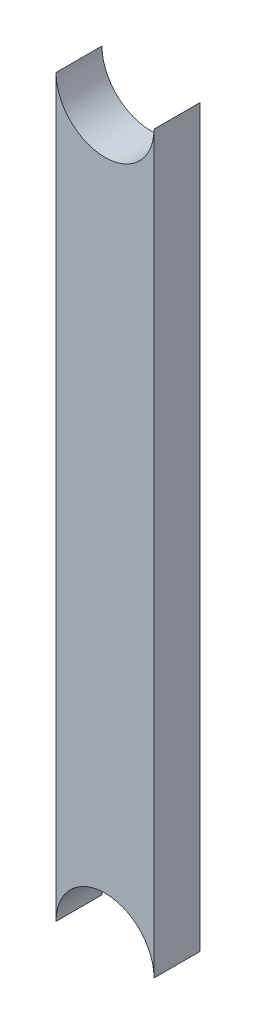
ISO-10303-21;
HEADER;
FILE_DESCRIPTION(('STEP AP214'),'2;1');
FILE_NAME('part.step','',(''),(''),'','','');
FILE_SCHEMA(('AUTOMOTIVE_DESIGN { 1 0 10303 214 1 1 1 1 }'));
ENDSEC;
DATA;
#1=APPLICATION_CONTEXT('core data for automotive mechanical design processes');
#2=APPLICATION_PROTOCOL_DEFINITION('international standard','automotive_design',2000,#1);
#3=PRODUCT_CONTEXT('',#1,'mechanical');
#4=PRODUCT('Part','Part','',(#3));
#5=PRODUCT_RELATED_PRODUCT_CATEGORY('part','',(#4));
#6=PRODUCT_DEFINITION_FORMATION('','',#4);
#7=PRODUCT_DEFINITION_CONTEXT('part definition',#1,'design');
#8=PRODUCT_DEFINITION('design','',#6,#7);
#9=PRODUCT_DEFINITION_SHAPE('','',#8);
#10=(LENGTH_UNIT() NAMED_UNIT(*) SI_UNIT(.MILLI.,.METRE.));
#11=(NAMED_UNIT(*) PLANE_ANGLE_UNIT() SI_UNIT($,.RADIAN.));
#12=(NAMED_UNIT(*) SI_UNIT($,.STERADIAN.) SOLID_ANGLE_UNIT());
#13=UNCERTAINTY_MEASURE_WITH_UNIT(LENGTH_MEASURE(1.E-05),#10,'distance_accuracy_value','');
#14=(GEOMETRIC_REPRESENTATION_CONTEXT(3) GLOBAL_UNCERTAINTY_ASSIGNED_CONTEXT((#13)) GLOBAL_UNIT_ASSIGNED_CONTEXT((#10,
#11,#12)) REPRESENTATION_CONTEXT('',''));
#15=CARTESIAN_POINT('',(0.,0.,0.));
#16=DIRECTION('',(0.,0.,1.));
#17=DIRECTION('',(1.,0.,0.));
#18=AXIS2_PLACEMENT_3D('',#15,#16,#17);
#19=CARTESIAN_POINT('',(0.,48.,3.));
#20=DIRECTION('',(0.,0.,-1.));
#21=DIRECTION('',(-1.,0.,0.));
#22=AXIS2_PLACEMENT_3D('',#19,#20,#21);
#23=CYLINDRICAL_SURFACE('',#22,3.2);
#24=CARTESIAN_POINT('',(0.,48.,0.));
#25=DIRECTION('',(0.,0.,-1.));
#26=DIRECTION('',(1.,0.,0.));
#27=AXIS2_PLACEMENT_3D('',#24,#25,#26);
#28=CIRCLE('',#27,3.2);
#29=CARTESIAN_POINT('',(3.2,48.,0.));
#30=VERTEX_POINT('',#29);
#31=CARTESIAN_POINT('',(-3.2,48.,0.));
#32=VERTEX_POINT('',#31);
#33=EDGE_CURVE('E106',#30,#32,#28,.T.);
#34=ORIENTED_EDGE('',*,*,#33,.T.);
#35=DIRECTION('',(0.,0.,-1.));
#36=VECTOR('',#35,1.);
#37=CARTESIAN_POINT('',(-3.2,48.,3.));
#38=LINE('',#37,#36);
#39=CARTESIAN_POINT('',(-3.2,48.,3.));
#40=VERTEX_POINT('',#39);
#41=EDGE_CURVE('E11',#40,#32,#38,.T.);
#42=ORIENTED_EDGE('',*,*,#41,.F.);
#43=CARTESIAN_POINT('',(0.,48.,3.));
#44=DIRECTION('',(0.,0.,-1.));
#45=DIRECTION('',(1.,0.,0.));
#46=AXIS2_PLACEMENT_3D('',#43,#44,#45);
#47=CIRCLE('',#46,3.2);
#48=CARTESIAN_POINT('',(3.2,48.,3.));
#49=VERTEX_POINT('',#48);
#50=EDGE_CURVE('E94',#49,#40,#47,.T.);
#51=ORIENTED_EDGE('',*,*,#50,.F.);
#52=DIRECTION('',(0.,0.,-1.));
#53=VECTOR('',#52,1.);
#54=CARTESIAN_POINT('',(3.2,48.,3.));
#55=LINE('',#54,#53);
#56=EDGE_CURVE('E102',#49,#30,#55,.T.);
#57=ORIENTED_EDGE('',*,*,#56,.T.);
#58=EDGE_LOOP('',(#34,#42,#51,#57));
#59=FACE_BOUND('',#58,.T.);
#60=ADVANCED_FACE('F43',(#59),#23,.F.);
#61=CARTESIAN_POINT('',(-3.2,0.,3.));
#62=DIRECTION('',(1.,0.,0.));
#63=DIRECTION('',(0.,1.,0.));
#64=AXIS2_PLACEMENT_3D('',#61,#62,#63);
#65=PLANE('',#64);
#66=DIRECTION('',(0.,-1.,0.));
#67=VECTOR('',#66,1.);
#68=CARTESIAN_POINT('',(-3.2,0.,0.));
#69=LINE('',#68,#67);
#70=CARTESIAN_POINT('',(-3.2,0.,0.));
#71=VERTEX_POINT('',#70);
#72=EDGE_CURVE('E98',#32,#71,#69,.T.);
#73=ORIENTED_EDGE('',*,*,#72,.T.);
#74=DIRECTION('',(0.,0.,-1.));
#75=VECTOR('',#74,1.);
#76=CARTESIAN_POINT('',(-3.2,0.,3.));
#77=LINE('',#76,#75);
#78=CARTESIAN_POINT('',(-3.2,0.,3.));
#79=VERTEX_POINT('',#78);
#80=EDGE_CURVE('E51',#79,#71,#77,.T.);
#81=ORIENTED_EDGE('',*,*,#80,.F.);
#82=DIRECTION('',(0.,-1.,0.));
#83=VECTOR('',#82,1.);
#84=CARTESIAN_POINT('',(-3.2,0.,3.));
#85=LINE('',#84,#83);
#86=EDGE_CURVE('E89',#40,#79,#85,.T.);
#87=ORIENTED_EDGE('',*,*,#86,.F.);
#88=ORIENTED_EDGE('',*,*,#41,.T.);
#89=EDGE_LOOP('',(#73,#81,#87,#88));
#90=FACE_BOUND('',#89,.T.);
#91=ADVANCED_FACE('F97',(#90),#65,.F.);
#92=CARTESIAN_POINT('',(0.,0.,3.));
#93=DIRECTION('',(0.,0.,-1.));
#94=DIRECTION('',(-1.,0.,0.));
#95=AXIS2_PLACEMENT_3D('',#92,#93,#94);
#96=CYLINDRICAL_SURFACE('',#95,3.2);
#97=CARTESIAN_POINT('',(0.,0.,0.));
#98=DIRECTION('',(0.,0.,-1.));
#99=DIRECTION('',(1.,0.,0.));
#100=AXIS2_PLACEMENT_3D('',#97,#98,#99);
#101=CIRCLE('',#100,3.2);
#102=CARTESIAN_POINT('',(3.2,0.,0.));
#103=VERTEX_POINT('',#102);
#104=EDGE_CURVE('E76',#71,#103,#101,.T.);
#105=ORIENTED_EDGE('',*,*,#104,.T.);
#106=DIRECTION('',(0.,0.,-1.));
#107=VECTOR('',#106,1.);
#108=CARTESIAN_POINT('',(3.2,0.,3.));
#109=LINE('',#108,#107);
#110=CARTESIAN_POINT('',(3.2,0.,3.));
#111=VERTEX_POINT('',#110);
#112=EDGE_CURVE('E99',#111,#103,#109,.T.);
#113=ORIENTED_EDGE('',*,*,#112,.F.);
#114=CARTESIAN_POINT('',(0.,0.,3.));
#115=DIRECTION('',(0.,0.,-1.));
#116=DIRECTION('',(1.,0.,0.));
#117=AXIS2_PLACEMENT_3D('',#114,#115,#116);
#118=CIRCLE('',#117,3.2);
#119=EDGE_CURVE('E92',#79,#111,#118,.T.);
#120=ORIENTED_EDGE('',*,*,#119,.F.);
#121=ORIENTED_EDGE('',*,*,#80,.T.);
#122=EDGE_LOOP('',(#105,#113,#120,#121));
#123=FACE_BOUND('',#122,.T.);
#124=ADVANCED_FACE('F100',(#123),#96,.F.);
#125=CARTESIAN_POINT('',(3.2,48.,3.));
#126=DIRECTION('',(-1.,0.,0.));
#127=DIRECTION('',(0.,-1.,0.));
#128=AXIS2_PLACEMENT_3D('',#125,#126,#127);
#129=PLANE('',#128);
#130=DIRECTION('',(0.,1.,0.));
#131=VECTOR('',#130,1.);
#132=CARTESIAN_POINT('',(3.2,48.,0.));
#133=LINE('',#132,#131);
#134=EDGE_CURVE('E82',#103,#30,#133,.T.);
#135=ORIENTED_EDGE('',*,*,#134,.T.);
#136=ORIENTED_EDGE('',*,*,#56,.F.);
#137=DIRECTION('',(0.,1.,0.));
#138=VECTOR('',#137,1.);
#139=CARTESIAN_POINT('',(3.2,48.,3.));
#140=LINE('',#139,#138);
#141=EDGE_CURVE('E59',#111,#49,#140,.T.);
#142=ORIENTED_EDGE('',*,*,#141,.F.);
#143=ORIENTED_EDGE('',*,*,#112,.T.);
#144=EDGE_LOOP('',(#135,#136,#142,#143));
#145=FACE_BOUND('',#144,.T.);
#146=ADVANCED_FACE('F113',(#145),#129,.F.);
#147=CARTESIAN_POINT('',(0.,48.,3.));
#148=DIRECTION('',(0.,0.,1.));
#149=DIRECTION('',(1.,0.,0.));
#150=AXIS2_PLACEMENT_3D('',#147,#148,#149);
#151=PLANE('',#150);
#152=ORIENTED_EDGE('',*,*,#50,.T.);
#153=ORIENTED_EDGE('',*,*,#86,.T.);
#154=ORIENTED_EDGE('',*,*,#119,.T.);
#155=ORIENTED_EDGE('',*,*,#141,.T.);
#156=EDGE_LOOP('',(#152,#153,#154,#155));
#157=FACE_BOUND('',#156,.T.);
#158=ADVANCED_FACE('F90',(#157),#151,.T.);
#159=CARTESIAN_POINT('',(0.,48.,0.));
#160=DIRECTION('',(0.,0.,1.));
#161=DIRECTION('',(1.,0.,0.));
#162=AXIS2_PLACEMENT_3D('',#159,#160,#161);
#163=PLANE('',#162);
#164=ORIENTED_EDGE('',*,*,#33,.F.);
#165=ORIENTED_EDGE('',*,*,#134,.F.);
#166=ORIENTED_EDGE('',*,*,#104,.F.);
#167=ORIENTED_EDGE('',*,*,#72,.F.);
#168=EDGE_LOOP('',(#164,#165,#166,#167));
#169=FACE_BOUND('',#168,.T.);
#170=ADVANCED_FACE('F116',(#169),#163,.F.);
#171=CLOSED_SHELL('',(#60,#91,#124,#146,#158,#170));
#172=MANIFOLD_SOLID_BREP('B2',#171);
#173=ADVANCED_BREP_SHAPE_REPRESENTATION('',(#18,#172),#14);
#174=SHAPE_DEFINITION_REPRESENTATION(#9,#173);
ENDSEC;
END-ISO-10303-21;
